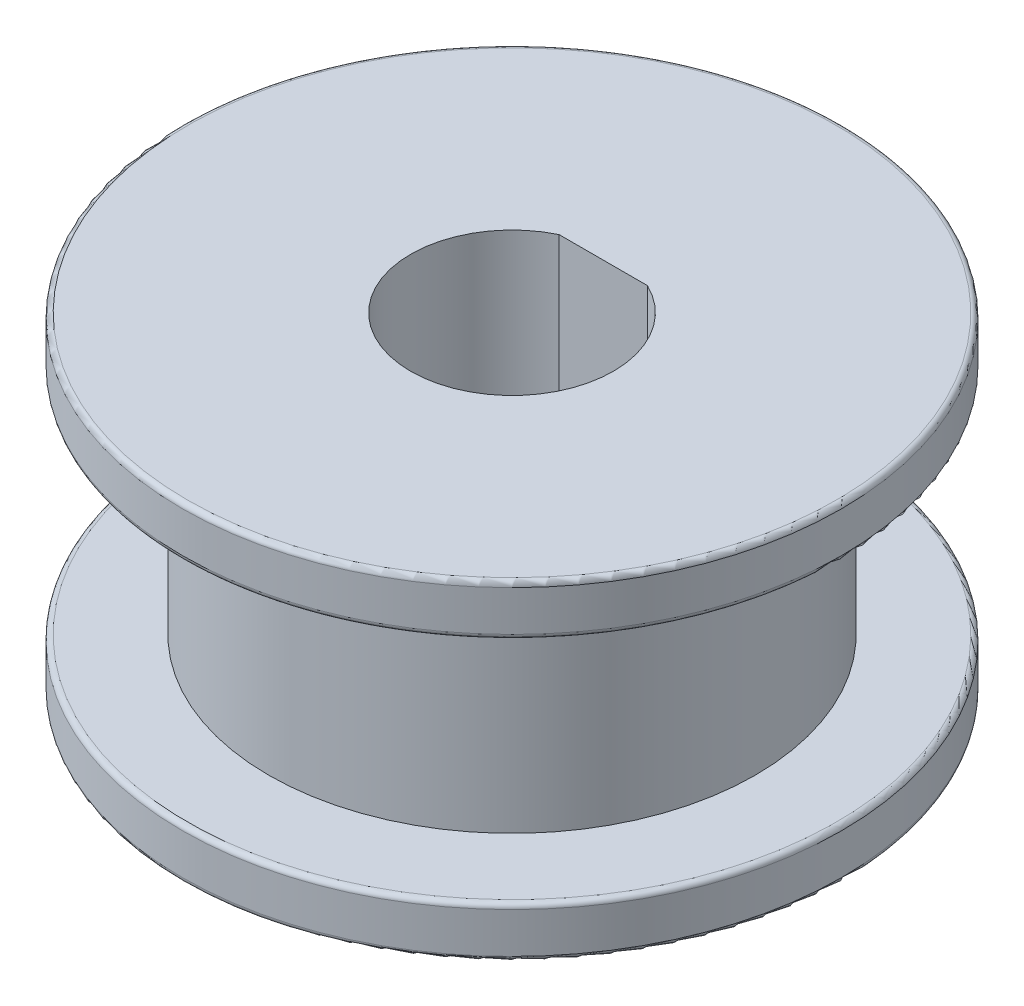
ISO-10303-21;
HEADER;
FILE_DESCRIPTION(('STEP AP214'),'2;1');
FILE_NAME('part.step','',(''),(''),'','','');
FILE_SCHEMA(('AUTOMOTIVE_DESIGN { 1 0 10303 214 1 1 1 1 }'));
ENDSEC;
DATA;
#1=APPLICATION_CONTEXT('core data for automotive mechanical design processes');
#2=APPLICATION_PROTOCOL_DEFINITION('international standard','automotive_design',2000,#1);
#3=PRODUCT_CONTEXT('',#1,'mechanical');
#4=PRODUCT('Part','Part','',(#3));
#5=PRODUCT_RELATED_PRODUCT_CATEGORY('part','',(#4));
#6=PRODUCT_DEFINITION_FORMATION('','',#4);
#7=PRODUCT_DEFINITION_CONTEXT('part definition',#1,'design');
#8=PRODUCT_DEFINITION('design','',#6,#7);
#9=PRODUCT_DEFINITION_SHAPE('','',#8);
#10=(LENGTH_UNIT() NAMED_UNIT(*) SI_UNIT(.MILLI.,.METRE.));
#11=(NAMED_UNIT(*) PLANE_ANGLE_UNIT() SI_UNIT($,.RADIAN.));
#12=(NAMED_UNIT(*) SI_UNIT($,.STERADIAN.) SOLID_ANGLE_UNIT());
#13=UNCERTAINTY_MEASURE_WITH_UNIT(LENGTH_MEASURE(1.E-05),#10,'distance_accuracy_value','');
#14=(GEOMETRIC_REPRESENTATION_CONTEXT(3) GLOBAL_UNCERTAINTY_ASSIGNED_CONTEXT((#13)) GLOBAL_UNIT_ASSIGNED_CONTEXT((#10,
#11,#12)) REPRESENTATION_CONTEXT('',''));
#15=CARTESIAN_POINT('',(0.,0.,0.));
#16=DIRECTION('',(0.,0.,1.));
#17=DIRECTION('',(1.,0.,0.));
#18=AXIS2_PLACEMENT_3D('',#15,#16,#17);
#19=CARTESIAN_POINT('',(0.,6.5,0.));
#20=DIRECTION('',(0.,-1.,0.));
#21=DIRECTION('',(0.,0.,-1.));
#22=AXIS2_PLACEMENT_3D('',#19,#20,#21);
#23=CYLINDRICAL_SURFACE('',#22,6.5);
#24=CARTESIAN_POINT('',(0.,5.6,0.));
#25=DIRECTION('',(0.,-1.,0.));
#26=DIRECTION('',(0.,0.,-1.));
#27=AXIS2_PLACEMENT_3D('',#24,#25,#26);
#28=CIRCLE('',#27,6.5);
#29=CARTESIAN_POINT('',(0.,5.6,-6.5));
#30=VERTEX_POINT('',#29);
#31=EDGE_CURVE('E99',#30,#30,#28,.F.);
#32=CARTESIAN_POINT('',(0.,6.4,0.));
#33=DIRECTION('',(0.,1.,0.));
#34=DIRECTION('',(0.,0.,1.));
#35=AXIS2_PLACEMENT_3D('',#32,#33,#34);
#36=CIRCLE('',#35,6.5);
#37=CARTESIAN_POINT('',(0.,6.4,-6.5));
#38=VERTEX_POINT('',#37);
#39=EDGE_CURVE('E96',#38,#38,#36,.F.);
#40=CARTESIAN_POINT('',(0.,5.6,-6.5));
#41=CARTESIAN_POINT('',(0.,5.60833333333333,-6.5));
#42=CARTESIAN_POINT('',(0.,5.61666666666667,-6.5));
#43=CARTESIAN_POINT('',(0.,5.63333333333333,-6.5));
#44=CARTESIAN_POINT('',(0.,5.64166666666667,-6.5));
#45=CARTESIAN_POINT('',(0.,5.65833333333333,-6.5));
#46=CARTESIAN_POINT('',(0.,5.66666666666667,-6.5));
#47=CARTESIAN_POINT('',(0.,5.68333333333333,-6.5));
#48=CARTESIAN_POINT('',(0.,5.69166666666667,-6.5));
#49=CARTESIAN_POINT('',(0.,5.70833333333333,-6.5));
#50=CARTESIAN_POINT('',(0.,5.71666666666667,-6.5));
#51=CARTESIAN_POINT('',(0.,5.73333333333333,-6.5));
#52=CARTESIAN_POINT('',(0.,5.74166666666667,-6.5));
#53=CARTESIAN_POINT('',(0.,5.75833333333333,-6.5));
#54=CARTESIAN_POINT('',(0.,5.76666666666667,-6.5));
#55=CARTESIAN_POINT('',(0.,5.78333333333333,-6.5));
#56=CARTESIAN_POINT('',(0.,5.79166666666667,-6.5));
#57=CARTESIAN_POINT('',(0.,5.80833333333333,-6.5));
#58=CARTESIAN_POINT('',(0.,5.81666666666667,-6.5));
#59=CARTESIAN_POINT('',(0.,5.83333333333333,-6.5));
#60=CARTESIAN_POINT('',(0.,5.84166666666667,-6.5));
#61=CARTESIAN_POINT('',(0.,5.85833333333333,-6.5));
#62=CARTESIAN_POINT('',(0.,5.86666666666667,-6.5));
#63=CARTESIAN_POINT('',(0.,5.88333333333333,-6.5));
#64=CARTESIAN_POINT('',(0.,5.89166666666667,-6.5));
#65=CARTESIAN_POINT('',(0.,5.90833333333333,-6.5));
#66=CARTESIAN_POINT('',(0.,5.91666666666667,-6.5));
#67=CARTESIAN_POINT('',(0.,5.93333333333333,-6.5));
#68=CARTESIAN_POINT('',(0.,5.94166666666667,-6.5));
#69=CARTESIAN_POINT('',(0.,5.95833333333333,-6.5));
#70=CARTESIAN_POINT('',(0.,5.96666666666667,-6.5));
#71=CARTESIAN_POINT('',(0.,5.98333333333333,-6.5));
#72=CARTESIAN_POINT('',(0.,5.99166666666667,-6.5));
#73=CARTESIAN_POINT('',(0.,6.00833333333333,-6.5));
#74=CARTESIAN_POINT('',(0.,6.01666666666667,-6.5));
#75=CARTESIAN_POINT('',(0.,6.03333333333333,-6.5));
#76=CARTESIAN_POINT('',(0.,6.04166666666667,-6.5));
#77=CARTESIAN_POINT('',(0.,6.05833333333333,-6.5));
#78=CARTESIAN_POINT('',(0.,6.06666666666667,-6.5));
#79=CARTESIAN_POINT('',(0.,6.08333333333333,-6.5));
#80=CARTESIAN_POINT('',(0.,6.09166666666667,-6.5));
#81=CARTESIAN_POINT('',(0.,6.10833333333333,-6.5));
#82=CARTESIAN_POINT('',(0.,6.11666666666667,-6.5));
#83=CARTESIAN_POINT('',(0.,6.13333333333333,-6.5));
#84=CARTESIAN_POINT('',(0.,6.14166666666667,-6.5));
#85=CARTESIAN_POINT('',(0.,6.15833333333333,-6.5));
#86=CARTESIAN_POINT('',(0.,6.16666666666667,-6.5));
#87=CARTESIAN_POINT('',(0.,6.18333333333333,-6.5));
#88=CARTESIAN_POINT('',(0.,6.19166666666667,-6.5));
#89=CARTESIAN_POINT('',(0.,6.20833333333333,-6.5));
#90=CARTESIAN_POINT('',(0.,6.21666666666667,-6.5));
#91=CARTESIAN_POINT('',(0.,6.23333333333333,-6.5));
#92=CARTESIAN_POINT('',(0.,6.24166666666667,-6.5));
#93=CARTESIAN_POINT('',(0.,6.25833333333333,-6.5));
#94=CARTESIAN_POINT('',(0.,6.26666666666667,-6.5));
#95=CARTESIAN_POINT('',(0.,6.28333333333333,-6.5));
#96=CARTESIAN_POINT('',(0.,6.29166666666667,-6.5));
#97=CARTESIAN_POINT('',(0.,6.30833333333333,-6.5));
#98=CARTESIAN_POINT('',(0.,6.31666666666667,-6.5));
#99=CARTESIAN_POINT('',(0.,6.33333333333333,-6.5));
#100=CARTESIAN_POINT('',(0.,6.34166666666667,-6.5));
#101=CARTESIAN_POINT('',(0.,6.35833333333333,-6.5));
#102=CARTESIAN_POINT('',(0.,6.36666666666667,-6.5));
#103=CARTESIAN_POINT('',(0.,6.38333333333333,-6.5));
#104=CARTESIAN_POINT('',(0.,6.39166666666667,-6.5));
#105=CARTESIAN_POINT('',(0.,6.4,-6.5));
#106=B_SPLINE_CURVE_WITH_KNOTS('',3,(#40,#41,#42,#43,#44,#45,#46,#47,#48,#49,#50,#51,#52,#53,
#54,#55,#56,#57,#58,#59,#60,#61,#62,#63,#64,#65,#66,#67,#68,#69,#70,#71,#72,#73,#74,#75,#76,#77,
#78,#79,#80,#81,#82,#83,#84,#85,#86,#87,#88,#89,#90,#91,#92,#93,#94,#95,#96,#97,#98,#99,#100,
#101,#102,#103,#104,#105),.UNSPECIFIED.,.F.,.F.,(4,2,2,2,2,2,2,2,2,2,2,2,2,2,2,2,2,2,2,2,2,2,2,
2,2,2,2,2,2,2,2,2,4),(0.,0.0249999999999998,0.0500000000000006,0.0750000000000004,0.1,0.125,
0.15,0.175,0.2,0.225,0.25,0.275,0.3,0.325,0.35,0.374999999999999,0.4,0.425,0.45,0.475,0.5,
0.524999999999999,0.549999999999999,0.574999999999999,0.6,0.625,0.65,0.674999999999999,
0.699999999999999,0.724999999999999,0.749999999999999,0.774999999999999,0.799999999999999),.UNSPECIFIED.);
#107=EDGE_CURVE('BSEAM35',#30,#38,#106,.T.);
#108=ORIENTED_EDGE('',*,*,#31,.T.);
#109=ORIENTED_EDGE('',*,*,#39,.T.);
#110=ORIENTED_EDGE('',*,*,#107,.T.);
#111=ORIENTED_EDGE('',*,*,#107,.F.);
#112=EDGE_LOOP('',(#108,#110,#109,#111));
#113=FACE_BOUND('',#112,.T.);
#114=ADVANCED_FACE('F35',(#113),#23,.T.);
#115=CARTESIAN_POINT('',(0.,6.5,0.));
#116=DIRECTION('',(0.,1.,0.));
#117=DIRECTION('',(0.,0.,1.));
#118=AXIS2_PLACEMENT_3D('',#115,#116,#117);
#119=PLANE('',#118);
#120=CARTESIAN_POINT('',(0.,6.5,0.));
#121=DIRECTION('',(0.,1.,0.));
#122=DIRECTION('',(0.,0.,1.));
#123=AXIS2_PLACEMENT_3D('',#120,#121,#122);
#124=CIRCLE('',#123,6.4);
#125=CARTESIAN_POINT('',(0.,6.5,6.4));
#126=VERTEX_POINT('',#125);
#127=EDGE_CURVE('E11',#126,#126,#124,.T.);
#128=ORIENTED_EDGE('',*,*,#127,.T.);
#129=EDGE_LOOP('',(#128));
#130=FACE_BOUND('',#129,.T.);
#131=DIRECTION('',(-1.,0.,0.));
#132=VECTOR('',#131,1.);
#133=CARTESIAN_POINT('',(0.871779788708135,6.5,-1.8));
#134=LINE('',#133,#132);
#135=CARTESIAN_POINT('',(0.871779788708135,6.5,-1.8));
#136=VERTEX_POINT('',#135);
#137=CARTESIAN_POINT('',(-0.871779788708135,6.5,-1.8));
#138=VERTEX_POINT('',#137);
#139=EDGE_CURVE('E81',#136,#138,#134,.T.);
#140=ORIENTED_EDGE('',*,*,#139,.F.);
#141=CARTESIAN_POINT('',(0.,6.5,0.));
#142=DIRECTION('',(0.,1.,0.));
#143=DIRECTION('',(0.,0.,1.));
#144=AXIS2_PLACEMENT_3D('',#141,#142,#143);
#145=CIRCLE('',#144,2.);
#146=EDGE_CURVE('E67',#138,#136,#145,.T.);
#147=ORIENTED_EDGE('',*,*,#146,.F.);
#148=EDGE_LOOP('',(#140,#147));
#149=FACE_BOUND('',#148,.T.);
#150=ADVANCED_FACE('F120',(#130,#149),#119,.T.);
#151=CARTESIAN_POINT('',(0.,0.,0.));
#152=DIRECTION('',(0.,1.,0.));
#153=DIRECTION('',(0.,0.,1.));
#154=AXIS2_PLACEMENT_3D('',#151,#152,#153);
#155=PLANE('',#154);
#156=CARTESIAN_POINT('',(0.,0.,0.));
#157=DIRECTION('',(0.,1.,0.));
#158=DIRECTION('',(0.,0.,1.));
#159=AXIS2_PLACEMENT_3D('',#156,#157,#158);
#160=CIRCLE('',#159,6.4);
#161=CARTESIAN_POINT('',(0.,0.,6.4));
#162=VERTEX_POINT('',#161);
#163=EDGE_CURVE('E43',#162,#162,#160,.F.);
#164=ORIENTED_EDGE('',*,*,#163,.T.);
#165=EDGE_LOOP('',(#164));
#166=FACE_BOUND('',#165,.T.);
#167=CARTESIAN_POINT('',(0.,0.,0.));
#168=DIRECTION('',(0.,1.,0.));
#169=DIRECTION('',(0.,0.,1.));
#170=AXIS2_PLACEMENT_3D('',#167,#168,#169);
#171=CIRCLE('',#170,2.);
#172=CARTESIAN_POINT('',(-0.871779788708135,0.,-1.8));
#173=VERTEX_POINT('',#172);
#174=CARTESIAN_POINT('',(0.871779788708135,0.,-1.8));
#175=VERTEX_POINT('',#174);
#176=EDGE_CURVE('E57',#173,#175,#171,.T.);
#177=ORIENTED_EDGE('',*,*,#176,.T.);
#178=DIRECTION('',(-1.,0.,0.));
#179=VECTOR('',#178,1.);
#180=CARTESIAN_POINT('',(0.871779788708135,0.,-1.8));
#181=LINE('',#180,#179);
#182=EDGE_CURVE('E63',#175,#173,#181,.T.);
#183=ORIENTED_EDGE('',*,*,#182,.T.);
#184=EDGE_LOOP('',(#177,#183));
#185=FACE_BOUND('',#184,.T.);
#186=ADVANCED_FACE('F74',(#166,#185),#155,.F.);
#187=CARTESIAN_POINT('',(0.,0.9,0.));
#188=DIRECTION('',(0.,-1.,0.));
#189=DIRECTION('',(0.,0.,-1.));
#190=AXIS2_PLACEMENT_3D('',#187,#188,#189);
#191=CIRCLE('',#190,6.5);
#192=CARTESIAN_POINT('',(0.,0.9,-6.5));
#193=VERTEX_POINT('',#192);
#194=EDGE_CURVE('E87',#193,#193,#191,.T.);
#195=CARTESIAN_POINT('',(0.,0.1,0.));
#196=DIRECTION('',(0.,1.,0.));
#197=DIRECTION('',(0.,0.,1.));
#198=AXIS2_PLACEMENT_3D('',#195,#196,#197);
#199=CIRCLE('',#198,6.5);
#200=CARTESIAN_POINT('',(0.,0.0999999999999994,-6.5));
#201=VERTEX_POINT('',#200);
#202=EDGE_CURVE('E72',#201,#201,#199,.T.);
#203=CARTESIAN_POINT('',(0.,0.9,-6.5));
#204=CARTESIAN_POINT('',(0.,0.891666666666666,-6.5));
#205=CARTESIAN_POINT('',(0.,0.883333333333333,-6.5));
#206=CARTESIAN_POINT('',(0.,0.866666666666667,-6.5));
#207=CARTESIAN_POINT('',(0.,0.858333333333333,-6.5));
#208=CARTESIAN_POINT('',(0.,0.841666666666666,-6.5));
#209=CARTESIAN_POINT('',(0.,0.833333333333333,-6.5));
#210=CARTESIAN_POINT('',(0.,0.816666666666666,-6.5));
#211=CARTESIAN_POINT('',(0.,0.808333333333333,-6.5));
#212=CARTESIAN_POINT('',(0.,0.791666666666666,-6.5));
#213=CARTESIAN_POINT('',(0.,0.783333333333333,-6.5));
#214=CARTESIAN_POINT('',(0.,0.766666666666666,-6.5));
#215=CARTESIAN_POINT('',(0.,0.758333333333333,-6.5));
#216=CARTESIAN_POINT('',(0.,0.741666666666666,-6.5));
#217=CARTESIAN_POINT('',(0.,0.733333333333333,-6.5));
#218=CARTESIAN_POINT('',(0.,0.716666666666666,-6.5));
#219=CARTESIAN_POINT('',(0.,0.708333333333333,-6.5));
#220=CARTESIAN_POINT('',(0.,0.691666666666666,-6.5));
#221=CARTESIAN_POINT('',(0.,0.683333333333333,-6.5));
#222=CARTESIAN_POINT('',(0.,0.666666666666666,-6.5));
#223=CARTESIAN_POINT('',(0.,0.658333333333333,-6.5));
#224=CARTESIAN_POINT('',(0.,0.641666666666666,-6.5));
#225=CARTESIAN_POINT('',(0.,0.633333333333333,-6.5));
#226=CARTESIAN_POINT('',(0.,0.616666666666666,-6.5));
#227=CARTESIAN_POINT('',(0.,0.608333333333333,-6.5));
#228=CARTESIAN_POINT('',(0.,0.591666666666667,-6.5));
#229=CARTESIAN_POINT('',(0.,0.583333333333333,-6.5));
#230=CARTESIAN_POINT('',(0.,0.566666666666666,-6.5));
#231=CARTESIAN_POINT('',(0.,0.558333333333333,-6.5));
#232=CARTESIAN_POINT('',(0.,0.541666666666666,-6.5));
#233=CARTESIAN_POINT('',(0.,0.533333333333333,-6.5));
#234=CARTESIAN_POINT('',(0.,0.516666666666666,-6.5));
#235=CARTESIAN_POINT('',(0.,0.508333333333333,-6.5));
#236=CARTESIAN_POINT('',(0.,0.491666666666666,-6.5));
#237=CARTESIAN_POINT('',(0.,0.483333333333333,-6.5));
#238=CARTESIAN_POINT('',(0.,0.466666666666666,-6.5));
#239=CARTESIAN_POINT('',(0.,0.458333333333333,-6.5));
#240=CARTESIAN_POINT('',(0.,0.441666666666666,-6.5));
#241=CARTESIAN_POINT('',(0.,0.433333333333333,-6.5));
#242=CARTESIAN_POINT('',(0.,0.416666666666666,-6.5));
#243=CARTESIAN_POINT('',(0.,0.408333333333333,-6.5));
#244=CARTESIAN_POINT('',(0.,0.391666666666666,-6.5));
#245=CARTESIAN_POINT('',(0.,0.383333333333333,-6.5));
#246=CARTESIAN_POINT('',(0.,0.366666666666666,-6.5));
#247=CARTESIAN_POINT('',(0.,0.358333333333333,-6.5));
#248=CARTESIAN_POINT('',(0.,0.341666666666666,-6.5));
#249=CARTESIAN_POINT('',(0.,0.333333333333333,-6.5));
#250=CARTESIAN_POINT('',(0.,0.316666666666666,-6.5));
#251=CARTESIAN_POINT('',(0.,0.308333333333333,-6.5));
#252=CARTESIAN_POINT('',(0.,0.291666666666666,-6.5));
#253=CARTESIAN_POINT('',(0.,0.283333333333333,-6.5));
#254=CARTESIAN_POINT('',(0.,0.266666666666666,-6.5));
#255=CARTESIAN_POINT('',(0.,0.258333333333333,-6.5));
#256=CARTESIAN_POINT('',(0.,0.241666666666666,-6.5));
#257=CARTESIAN_POINT('',(0.,0.233333333333333,-6.5));
#258=CARTESIAN_POINT('',(0.,0.216666666666666,-6.5));
#259=CARTESIAN_POINT('',(0.,0.208333333333333,-6.5));
#260=CARTESIAN_POINT('',(0.,0.191666666666666,-6.5));
#261=CARTESIAN_POINT('',(0.,0.183333333333333,-6.5));
#262=CARTESIAN_POINT('',(0.,0.166666666666666,-6.5));
#263=CARTESIAN_POINT('',(0.,0.158333333333333,-6.5));
#264=CARTESIAN_POINT('',(0.,0.141666666666666,-6.5));
#265=CARTESIAN_POINT('',(0.,0.133333333333333,-6.5));
#266=CARTESIAN_POINT('',(0.,0.116666666666666,-6.5));
#267=CARTESIAN_POINT('',(0.,0.108333333333333,-6.5));
#268=CARTESIAN_POINT('',(0.,0.0999999999999994,-6.5));
#269=B_SPLINE_CURVE_WITH_KNOTS('',3,(#203,#204,#205,#206,#207,#208,#209,#210,#211,#212,#213,
#214,#215,#216,#217,#218,#219,#220,#221,#222,#223,#224,#225,#226,#227,#228,#229,#230,#231,#232,
#233,#234,#235,#236,#237,#238,#239,#240,#241,#242,#243,#244,#245,#246,#247,#248,#249,#250,#251,
#252,#253,#254,#255,#256,#257,#258,#259,#260,#261,#262,#263,#264,#265,#266,#267,#268),
.UNSPECIFIED.,.F.,.F.,(4,2,2,2,2,2,2,2,2,2,2,2,2,2,2,2,2,2,2,2,2,2,2,2,2,2,2,2,2,2,2,2,4),(0.,
0.0249999999999998,0.0499999999999997,0.0750000000000004,0.1,0.125,0.15,0.175,0.200000000000001,
0.225,0.25,0.275,0.3,0.325,0.35,0.375,0.4,0.425,0.45,0.475000000000001,0.5,0.525,0.55,0.575,0.6,
0.625000000000001,0.65,0.675,0.7,0.725,0.750000000000001,0.775,0.8),.UNSPECIFIED.);
#270=EDGE_CURVE('BSEAM111',#193,#201,#269,.T.);
#271=ORIENTED_EDGE('',*,*,#194,.T.);
#272=ORIENTED_EDGE('',*,*,#202,.T.);
#273=ORIENTED_EDGE('',*,*,#270,.T.);
#274=ORIENTED_EDGE('',*,*,#270,.F.);
#275=EDGE_LOOP('',(#271,#273,#272,#274));
#276=FACE_BOUND('',#275,.T.);
#277=ADVANCED_FACE('F111',(#276),#23,.T.);
#278=CARTESIAN_POINT('',(0.,6.5,0.));
#279=DIRECTION('',(0.,-1.,0.));
#280=DIRECTION('',(0.,0.,-1.));
#281=AXIS2_PLACEMENT_3D('',#278,#279,#280);
#282=CYLINDRICAL_SURFACE('',#281,2.);
#283=ORIENTED_EDGE('',*,*,#176,.F.);
#284=DIRECTION('',(0.,-1.,0.));
#285=VECTOR('',#284,1.);
#286=CARTESIAN_POINT('',(-0.871779788708135,6.5,-1.8));
#287=LINE('',#286,#285);
#288=EDGE_CURVE('E65',#138,#173,#287,.T.);
#289=ORIENTED_EDGE('',*,*,#288,.F.);
#290=ORIENTED_EDGE('',*,*,#146,.T.);
#291=DIRECTION('',(0.,-1.,0.));
#292=VECTOR('',#291,1.);
#293=CARTESIAN_POINT('',(0.871779788708135,6.5,-1.8));
#294=LINE('',#293,#292);
#295=EDGE_CURVE('E50',#136,#175,#294,.T.);
#296=ORIENTED_EDGE('',*,*,#295,.T.);
#297=EDGE_LOOP('',(#283,#289,#290,#296));
#298=FACE_BOUND('',#297,.T.);
#299=ADVANCED_FACE('F69',(#298),#282,.F.);
#300=CARTESIAN_POINT('',(0.871779788708135,6.5,-1.8));
#301=DIRECTION('',(0.,0.,1.));
#302=DIRECTION('',(1.,0.,0.));
#303=AXIS2_PLACEMENT_3D('',#300,#301,#302);
#304=PLANE('',#303);
#305=ORIENTED_EDGE('',*,*,#182,.F.);
#306=ORIENTED_EDGE('',*,*,#295,.F.);
#307=ORIENTED_EDGE('',*,*,#139,.T.);
#308=ORIENTED_EDGE('',*,*,#288,.T.);
#309=EDGE_LOOP('',(#305,#306,#307,#308));
#310=FACE_BOUND('',#309,.T.);
#311=ADVANCED_FACE('F64',(#310),#304,.T.);
#312=CARTESIAN_POINT('',(0.,5.5,0.));
#313=DIRECTION('',(0.,-1.,0.));
#314=DIRECTION('',(0.,0.,-1.));
#315=AXIS2_PLACEMENT_3D('',#312,#313,#314);
#316=PLANE('',#315);
#317=CARTESIAN_POINT('',(0.,5.5,0.));
#318=DIRECTION('',(0.,-1.,0.));
#319=DIRECTION('',(0.,0.,-1.));
#320=AXIS2_PLACEMENT_3D('',#317,#318,#319);
#321=CIRCLE('',#320,6.4);
#322=CARTESIAN_POINT('',(0.,5.5,-6.4));
#323=VERTEX_POINT('',#322);
#324=EDGE_CURVE('E93',#323,#323,#321,.T.);
#325=ORIENTED_EDGE('',*,*,#324,.T.);
#326=EDGE_LOOP('',(#325));
#327=FACE_BOUND('',#326,.T.);
#328=CARTESIAN_POINT('',(0.,5.5,0.));
#329=DIRECTION('',(0.,-1.,0.));
#330=DIRECTION('',(0.,0.,-1.));
#331=AXIS2_PLACEMENT_3D('',#328,#329,#330);
#332=CIRCLE('',#331,4.8);
#333=CARTESIAN_POINT('',(0.,5.5,-4.8));
#334=VERTEX_POINT('',#333);
#335=EDGE_CURVE('E75',#334,#334,#332,.T.);
#336=ORIENTED_EDGE('',*,*,#335,.F.);
#337=EDGE_LOOP('',(#336));
#338=FACE_BOUND('',#337,.T.);
#339=ADVANCED_FACE('F154',(#327,#338),#316,.T.);
#340=CARTESIAN_POINT('',(0.,1.,0.));
#341=DIRECTION('',(0.,-1.,0.));
#342=DIRECTION('',(0.,0.,-1.));
#343=AXIS2_PLACEMENT_3D('',#340,#341,#342);
#344=PLANE('',#343);
#345=CARTESIAN_POINT('',(0.,1.,0.));
#346=DIRECTION('',(0.,-1.,0.));
#347=DIRECTION('',(0.,0.,-1.));
#348=AXIS2_PLACEMENT_3D('',#345,#346,#347);
#349=CIRCLE('',#348,6.4);
#350=CARTESIAN_POINT('',(0.,1.,-6.4));
#351=VERTEX_POINT('',#350);
#352=EDGE_CURVE('E90',#351,#351,#349,.F.);
#353=ORIENTED_EDGE('',*,*,#352,.T.);
#354=EDGE_LOOP('',(#353));
#355=FACE_BOUND('',#354,.T.);
#356=CARTESIAN_POINT('',(0.,1.,0.));
#357=DIRECTION('',(0.,-1.,0.));
#358=DIRECTION('',(0.,0.,-1.));
#359=AXIS2_PLACEMENT_3D('',#356,#357,#358);
#360=CIRCLE('',#359,4.8);
#361=CARTESIAN_POINT('',(0.,1.,-4.8));
#362=VERTEX_POINT('',#361);
#363=EDGE_CURVE('E78',#362,#362,#360,.T.);
#364=ORIENTED_EDGE('',*,*,#363,.T.);
#365=EDGE_LOOP('',(#364));
#366=FACE_BOUND('',#365,.T.);
#367=ADVANCED_FACE('F142',(#355,#366),#344,.F.);
#368=CARTESIAN_POINT('',(0.,5.5,0.));
#369=DIRECTION('',(0.,-1.,0.));
#370=DIRECTION('',(0.,0.,-1.));
#371=AXIS2_PLACEMENT_3D('',#368,#369,#370);
#372=CYLINDRICAL_SURFACE('',#371,4.8);
#373=ORIENTED_EDGE('',*,*,#335,.T.);
#374=EDGE_LOOP('',(#373));
#375=FACE_BOUND('',#374,.T.);
#376=ORIENTED_EDGE('',*,*,#363,.F.);
#377=EDGE_LOOP('',(#376));
#378=FACE_BOUND('',#377,.T.);
#379=ADVANCED_FACE('F144',(#375,#378),#372,.T.);
#380=CARTESIAN_POINT('',(0.,0.9,0.));
#381=DIRECTION('',(0.,-1.,0.));
#382=DIRECTION('',(0.,0.,-1.));
#383=AXIS2_PLACEMENT_3D('',#380,#381,#382);
#384=TOROIDAL_SURFACE('',#383,6.4,0.1);
#385=ORIENTED_EDGE('',*,*,#352,.F.);
#386=EDGE_LOOP('',(#385));
#387=FACE_BOUND('',#386,.T.);
#388=ORIENTED_EDGE('',*,*,#194,.F.);
#389=EDGE_LOOP('',(#388));
#390=FACE_BOUND('',#389,.T.);
#391=ADVANCED_FACE('F146',(#387,#390),#384,.T.);
#392=CARTESIAN_POINT('',(0.,5.6,0.));
#393=DIRECTION('',(0.,-1.,0.));
#394=DIRECTION('',(0.,0.,-1.));
#395=AXIS2_PLACEMENT_3D('',#392,#393,#394);
#396=TOROIDAL_SURFACE('',#395,6.4,0.1);
#397=ORIENTED_EDGE('',*,*,#31,.F.);
#398=EDGE_LOOP('',(#397));
#399=FACE_BOUND('',#398,.T.);
#400=ORIENTED_EDGE('',*,*,#324,.F.);
#401=EDGE_LOOP('',(#400));
#402=FACE_BOUND('',#401,.T.);
#403=ADVANCED_FACE('F108',(#399,#402),#396,.T.);
#404=CARTESIAN_POINT('',(0.,0.1,0.));
#405=DIRECTION('',(0.,1.,0.));
#406=DIRECTION('',(0.,0.,1.));
#407=AXIS2_PLACEMENT_3D('',#404,#405,#406);
#408=TOROIDAL_SURFACE('',#407,6.4,0.1);
#409=ORIENTED_EDGE('',*,*,#163,.F.);
#410=EDGE_LOOP('',(#409));
#411=FACE_BOUND('',#410,.T.);
#412=ORIENTED_EDGE('',*,*,#202,.F.);
#413=EDGE_LOOP('',(#412));
#414=FACE_BOUND('',#413,.T.);
#415=ADVANCED_FACE('F105',(#411,#414),#408,.T.);
#416=CARTESIAN_POINT('',(0.,6.4,0.));
#417=DIRECTION('',(0.,1.,0.));
#418=DIRECTION('',(0.,0.,1.));
#419=AXIS2_PLACEMENT_3D('',#416,#417,#418);
#420=TOROIDAL_SURFACE('',#419,6.4,0.1);
#421=ORIENTED_EDGE('',*,*,#39,.F.);
#422=EDGE_LOOP('',(#421));
#423=FACE_BOUND('',#422,.T.);
#424=ORIENTED_EDGE('',*,*,#127,.F.);
#425=EDGE_LOOP('',(#424));
#426=FACE_BOUND('',#425,.T.);
#427=ADVANCED_FACE('F37',(#423,#426),#420,.T.);
#428=CLOSED_SHELL('',(#114,#150,#186,#277,#299,#311,#339,#367,#379,#391,#403,#415,#427));
#429=MANIFOLD_SOLID_BREP('B2',#428);
#430=ADVANCED_BREP_SHAPE_REPRESENTATION('',(#18,#429),#14);
#431=SHAPE_DEFINITION_REPRESENTATION(#9,#430);
ENDSEC;
END-ISO-10303-21;
